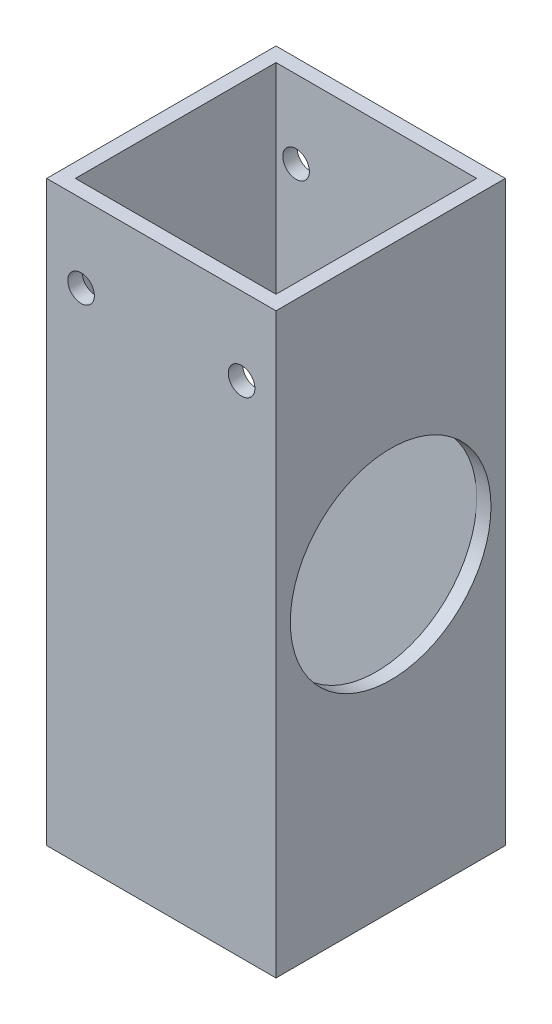
ISO-10303-21;
HEADER;
FILE_DESCRIPTION(('STEP AP214'),'2;1');
FILE_NAME('part.step','',(''),(''),'','','');
FILE_SCHEMA(('AUTOMOTIVE_DESIGN { 1 0 10303 214 1 1 1 1 }'));
ENDSEC;
DATA;
#1=APPLICATION_CONTEXT('core data for automotive mechanical design processes');
#2=APPLICATION_PROTOCOL_DEFINITION('international standard','automotive_design',2000,#1);
#3=PRODUCT_CONTEXT('',#1,'mechanical');
#4=PRODUCT('Part','Part','',(#3));
#5=PRODUCT_RELATED_PRODUCT_CATEGORY('part','',(#4));
#6=PRODUCT_DEFINITION_FORMATION('','',#4);
#7=PRODUCT_DEFINITION_CONTEXT('part definition',#1,'design');
#8=PRODUCT_DEFINITION('design','',#6,#7);
#9=PRODUCT_DEFINITION_SHAPE('','',#8);
#10=(LENGTH_UNIT() NAMED_UNIT(*) SI_UNIT(.MILLI.,.METRE.));
#11=(NAMED_UNIT(*) PLANE_ANGLE_UNIT() SI_UNIT($,.RADIAN.));
#12=(NAMED_UNIT(*) SI_UNIT($,.STERADIAN.) SOLID_ANGLE_UNIT());
#13=UNCERTAINTY_MEASURE_WITH_UNIT(LENGTH_MEASURE(1.E-05),#10,'distance_accuracy_value','');
#14=(GEOMETRIC_REPRESENTATION_CONTEXT(3) GLOBAL_UNCERTAINTY_ASSIGNED_CONTEXT((#13)) GLOBAL_UNIT_ASSIGNED_CONTEXT((#10,
#11,#12)) REPRESENTATION_CONTEXT('',''));
#15=CARTESIAN_POINT('',(0.,0.,0.));
#16=DIRECTION('',(0.,0.,1.));
#17=DIRECTION('',(1.,0.,0.));
#18=AXIS2_PLACEMENT_3D('',#15,#16,#17);
#19=CARTESIAN_POINT('',(11.1125,63.9989501845026,11.1125));
#20=DIRECTION('',(-1.,0.,0.));
#21=DIRECTION('',(0.,0.,1.));
#22=AXIS2_PLACEMENT_3D('',#19,#20,#21);
#23=PLANE('',#22);
#24=CARTESIAN_POINT('',(11.1125,33.3375,0.));
#25=DIRECTION('',(-1.,0.,0.));
#26=DIRECTION('',(0.,0.,1.));
#27=AXIS2_PLACEMENT_3D('',#24,#25,#26);
#28=CIRCLE('',#27,11.1125);
#29=CARTESIAN_POINT('',(11.1125,33.3375,11.1125));
#30=VERTEX_POINT('',#29);
#31=CARTESIAN_POINT('',(11.1125,33.3375,-11.1125));
#32=VERTEX_POINT('',#31);
#33=EDGE_CURVE('E59',#30,#32,#28,.T.);
#34=ORIENTED_EDGE('',*,*,#33,.F.);
#35=DIRECTION('',(0.,-1.,0.));
#36=VECTOR('',#35,1.);
#37=CARTESIAN_POINT('',(11.1125,63.9989501845026,11.1125));
#38=LINE('',#37,#36);
#39=CARTESIAN_POINT('',(11.1125,63.9989501845026,11.1125));
#40=VERTEX_POINT('',#39);
#41=EDGE_CURVE('E130',#40,#30,#38,.T.);
#42=ORIENTED_EDGE('',*,*,#41,.F.);
#43=DIRECTION('',(0.,0.,-1.));
#44=VECTOR('',#43,1.);
#45=CARTESIAN_POINT('',(11.1125,63.9989501845026,11.1125));
#46=LINE('',#45,#44);
#47=CARTESIAN_POINT('',(11.1125,63.9989501845026,-11.1125));
#48=VERTEX_POINT('',#47);
#49=EDGE_CURVE('E214',#40,#48,#46,.T.);
#50=ORIENTED_EDGE('',*,*,#49,.T.);
#51=DIRECTION('',(0.,-1.,0.));
#52=VECTOR('',#51,1.);
#53=CARTESIAN_POINT('',(11.1125,63.9989501845026,-11.1125));
#54=LINE('',#53,#52);
#55=EDGE_CURVE('E133',#48,#32,#54,.T.);
#56=ORIENTED_EDGE('',*,*,#55,.T.);
#57=EDGE_LOOP('',(#34,#42,#50,#56));
#58=FACE_BOUND('',#57,.T.);
#59=ADVANCED_FACE('F43',(#58),#23,.T.);
#60=CARTESIAN_POINT('',(-11.1125,63.9989501845026,-11.1125));
#61=DIRECTION('',(1.,0.,0.));
#62=DIRECTION('',(0.,0.,-1.));
#63=AXIS2_PLACEMENT_3D('',#60,#61,#62);
#64=PLANE('',#63);
#65=CARTESIAN_POINT('',(-11.1125,33.3375,0.));
#66=DIRECTION('',(1.,0.,0.));
#67=DIRECTION('',(0.,0.,-1.));
#68=AXIS2_PLACEMENT_3D('',#65,#66,#67);
#69=CIRCLE('',#68,11.1125);
#70=CARTESIAN_POINT('',(-11.1125,33.3375,-11.1125));
#71=VERTEX_POINT('',#70);
#72=CARTESIAN_POINT('',(-11.1125,33.3375,11.1125));
#73=VERTEX_POINT('',#72);
#74=EDGE_CURVE('E66',#71,#73,#69,.T.);
#75=ORIENTED_EDGE('',*,*,#74,.F.);
#76=DIRECTION('',(0.,-1.,0.));
#77=VECTOR('',#76,1.);
#78=CARTESIAN_POINT('',(-11.1125,63.9989501845026,-11.1125));
#79=LINE('',#78,#77);
#80=CARTESIAN_POINT('',(-11.1125,63.9989501845026,-11.1125));
#81=VERTEX_POINT('',#80);
#82=EDGE_CURVE('E155',#81,#71,#79,.T.);
#83=ORIENTED_EDGE('',*,*,#82,.F.);
#84=DIRECTION('',(0.,0.,1.));
#85=VECTOR('',#84,1.);
#86=CARTESIAN_POINT('',(-11.1125,63.9989501845026,-11.1125));
#87=LINE('',#86,#85);
#88=CARTESIAN_POINT('',(-11.1125,63.9989501845026,11.1125));
#89=VERTEX_POINT('',#88);
#90=EDGE_CURVE('E218',#81,#89,#87,.T.);
#91=ORIENTED_EDGE('',*,*,#90,.T.);
#92=DIRECTION('',(0.,-1.,0.));
#93=VECTOR('',#92,1.);
#94=CARTESIAN_POINT('',(-11.1125,63.9989501845026,11.1125));
#95=LINE('',#94,#93);
#96=EDGE_CURVE('E147',#89,#73,#95,.T.);
#97=ORIENTED_EDGE('',*,*,#96,.T.);
#98=EDGE_LOOP('',(#75,#83,#91,#97));
#99=FACE_BOUND('',#98,.T.);
#100=ADVANCED_FACE('F233',(#99),#64,.T.);
#101=CARTESIAN_POINT('',(0.,63.9989501845026,0.));
#102=DIRECTION('',(0.,1.,0.));
#103=DIRECTION('',(0.,0.,1.));
#104=AXIS2_PLACEMENT_3D('',#101,#102,#103);
#105=PLANE('',#104);
#106=DIRECTION('',(0.,0.,-1.));
#107=VECTOR('',#106,1.);
#108=CARTESIAN_POINT('',(12.7,63.9989501845026,12.7));
#109=LINE('',#108,#107);
#110=CARTESIAN_POINT('',(12.7,63.9989501845026,12.7));
#111=VERTEX_POINT('',#110);
#112=CARTESIAN_POINT('',(12.7,63.9989501845026,-12.7));
#113=VERTEX_POINT('',#112);
#114=EDGE_CURVE('E161',#111,#113,#109,.T.);
#115=ORIENTED_EDGE('',*,*,#114,.T.);
#116=DIRECTION('',(-1.,0.,0.));
#117=VECTOR('',#116,1.);
#118=CARTESIAN_POINT('',(12.7,63.9989501845026,-12.7));
#119=LINE('',#118,#117);
#120=CARTESIAN_POINT('',(-12.7,63.9989501845026,-12.7));
#121=VERTEX_POINT('',#120);
#122=EDGE_CURVE('E164',#113,#121,#119,.T.);
#123=ORIENTED_EDGE('',*,*,#122,.T.);
#124=DIRECTION('',(0.,0.,1.));
#125=VECTOR('',#124,1.);
#126=CARTESIAN_POINT('',(-12.7,63.9989501845026,-12.7));
#127=LINE('',#126,#125);
#128=CARTESIAN_POINT('',(-12.7,63.9989501845026,12.7));
#129=VERTEX_POINT('',#128);
#130=EDGE_CURVE('E167',#121,#129,#127,.T.);
#131=ORIENTED_EDGE('',*,*,#130,.T.);
#132=DIRECTION('',(1.,0.,0.));
#133=VECTOR('',#132,1.);
#134=CARTESIAN_POINT('',(-12.7,63.9989501845026,12.7));
#135=LINE('',#134,#133);
#136=EDGE_CURVE('E169',#129,#111,#135,.T.);
#137=ORIENTED_EDGE('',*,*,#136,.T.);
#138=EDGE_LOOP('',(#115,#123,#131,#137));
#139=FACE_BOUND('',#138,.T.);
#140=DIRECTION('',(-1.,0.,0.));
#141=VECTOR('',#140,1.);
#142=CARTESIAN_POINT('',(11.1125,63.9989501845026,-11.1125));
#143=LINE('',#142,#141);
#144=EDGE_CURVE('E216',#48,#81,#143,.T.);
#145=ORIENTED_EDGE('',*,*,#144,.F.);
#146=ORIENTED_EDGE('',*,*,#49,.F.);
#147=DIRECTION('',(1.,0.,0.));
#148=VECTOR('',#147,1.);
#149=CARTESIAN_POINT('',(-11.1125,63.9989501845026,11.1125));
#150=LINE('',#149,#148);
#151=EDGE_CURVE('E142',#89,#40,#150,.T.);
#152=ORIENTED_EDGE('',*,*,#151,.F.);
#153=ORIENTED_EDGE('',*,*,#90,.F.);
#154=EDGE_LOOP('',(#145,#146,#152,#153));
#155=FACE_BOUND('',#154,.T.);
#156=ADVANCED_FACE('F239',(#139,#155),#105,.T.);
#157=CARTESIAN_POINT('',(0.,0.,0.));
#158=DIRECTION('',(0.,1.,0.));
#159=DIRECTION('',(0.,0.,1.));
#160=AXIS2_PLACEMENT_3D('',#157,#158,#159);
#161=PLANE('',#160);
#162=DIRECTION('',(0.,0.,-1.));
#163=VECTOR('',#162,1.);
#164=CARTESIAN_POINT('',(12.7,0.,12.7));
#165=LINE('',#164,#163);
#166=CARTESIAN_POINT('',(12.7,0.,12.7));
#167=VERTEX_POINT('',#166);
#168=CARTESIAN_POINT('',(12.7,0.,-12.7));
#169=VERTEX_POINT('',#168);
#170=EDGE_CURVE('E160',#167,#169,#165,.T.);
#171=ORIENTED_EDGE('',*,*,#170,.F.);
#172=DIRECTION('',(1.,0.,0.));
#173=VECTOR('',#172,1.);
#174=CARTESIAN_POINT('',(-12.7,0.,12.7));
#175=LINE('',#174,#173);
#176=CARTESIAN_POINT('',(-12.7,0.,12.7));
#177=VERTEX_POINT('',#176);
#178=EDGE_CURVE('E165',#177,#167,#175,.T.);
#179=ORIENTED_EDGE('',*,*,#178,.F.);
#180=DIRECTION('',(0.,0.,1.));
#181=VECTOR('',#180,1.);
#182=CARTESIAN_POINT('',(-12.7,0.,-12.7));
#183=LINE('',#182,#181);
#184=CARTESIAN_POINT('',(-12.7,0.,-12.7));
#185=VERTEX_POINT('',#184);
#186=EDGE_CURVE('E176',#185,#177,#183,.T.);
#187=ORIENTED_EDGE('',*,*,#186,.F.);
#188=DIRECTION('',(-1.,0.,0.));
#189=VECTOR('',#188,1.);
#190=CARTESIAN_POINT('',(12.7,0.,-12.7));
#191=LINE('',#190,#189);
#192=EDGE_CURVE('E174',#169,#185,#191,.T.);
#193=ORIENTED_EDGE('',*,*,#192,.F.);
#194=EDGE_LOOP('',(#171,#179,#187,#193));
#195=FACE_BOUND('',#194,.T.);
#196=DIRECTION('',(0.,0.,-1.));
#197=VECTOR('',#196,1.);
#198=CARTESIAN_POINT('',(11.1125,0.,11.1125));
#199=LINE('',#198,#197);
#200=CARTESIAN_POINT('',(11.1125,0.,11.1125));
#201=VERTEX_POINT('',#200);
#202=CARTESIAN_POINT('',(11.1125,0.,-11.1125));
#203=VERTEX_POINT('',#202);
#204=EDGE_CURVE('E134',#201,#203,#199,.T.);
#205=ORIENTED_EDGE('',*,*,#204,.T.);
#206=DIRECTION('',(-1.,0.,0.));
#207=VECTOR('',#206,1.);
#208=CARTESIAN_POINT('',(11.1125,0.,-11.1125));
#209=LINE('',#208,#207);
#210=CARTESIAN_POINT('',(-11.1125,0.,-11.1125));
#211=VERTEX_POINT('',#210);
#212=EDGE_CURVE('E223',#203,#211,#209,.T.);
#213=ORIENTED_EDGE('',*,*,#212,.T.);
#214=DIRECTION('',(0.,0.,1.));
#215=VECTOR('',#214,1.);
#216=CARTESIAN_POINT('',(-11.1125,0.,-11.1125));
#217=LINE('',#216,#215);
#218=CARTESIAN_POINT('',(-11.1125,0.,11.1125));
#219=VERTEX_POINT('',#218);
#220=EDGE_CURVE('E225',#211,#219,#217,.T.);
#221=ORIENTED_EDGE('',*,*,#220,.T.);
#222=DIRECTION('',(1.,0.,0.));
#223=VECTOR('',#222,1.);
#224=CARTESIAN_POINT('',(-11.1125,0.,11.1125));
#225=LINE('',#224,#223);
#226=EDGE_CURVE('E150',#219,#201,#225,.T.);
#227=ORIENTED_EDGE('',*,*,#226,.T.);
#228=EDGE_LOOP('',(#205,#213,#221,#227));
#229=FACE_BOUND('',#228,.T.);
#230=ADVANCED_FACE('F229',(#195,#229),#161,.F.);
#231=CARTESIAN_POINT('',(12.7,63.9989501845026,12.7));
#232=DIRECTION('',(-1.,0.,0.));
#233=DIRECTION('',(0.,0.,1.));
#234=AXIS2_PLACEMENT_3D('',#231,#232,#233);
#235=PLANE('',#234);
#236=CARTESIAN_POINT('',(12.7,33.3375,0.));
#237=DIRECTION('',(1.,0.,0.));
#238=DIRECTION('',(0.,0.,-1.));
#239=AXIS2_PLACEMENT_3D('',#236,#237,#238);
#240=CIRCLE('',#239,11.1125);
#241=CARTESIAN_POINT('',(12.7,33.3375,-11.1125));
#242=VERTEX_POINT('',#241);
#243=EDGE_CURVE('E206',#242,#242,#240,.T.);
#244=ORIENTED_EDGE('',*,*,#243,.F.);
#245=EDGE_LOOP('',(#244));
#246=FACE_BOUND('',#245,.T.);
#247=ORIENTED_EDGE('',*,*,#170,.T.);
#248=DIRECTION('',(0.,-1.,0.));
#249=VECTOR('',#248,1.);
#250=CARTESIAN_POINT('',(12.7,63.9989501845026,-12.7));
#251=LINE('',#250,#249);
#252=EDGE_CURVE('E11',#113,#169,#251,.T.);
#253=ORIENTED_EDGE('',*,*,#252,.F.);
#254=ORIENTED_EDGE('',*,*,#114,.F.);
#255=DIRECTION('',(0.,-1.,0.));
#256=VECTOR('',#255,1.);
#257=CARTESIAN_POINT('',(12.7,63.9989501845026,12.7));
#258=LINE('',#257,#256);
#259=EDGE_CURVE('E171',#111,#167,#258,.T.);
#260=ORIENTED_EDGE('',*,*,#259,.T.);
#261=EDGE_LOOP('',(#247,#253,#254,#260));
#262=FACE_BOUND('',#261,.T.);
#263=ADVANCED_FACE('F45',(#246,#262),#235,.F.);
#264=CARTESIAN_POINT('',(12.7,63.9989501845026,-12.7));
#265=DIRECTION('',(0.,0.,1.));
#266=DIRECTION('',(1.,0.,0.));
#267=AXIS2_PLACEMENT_3D('',#264,#265,#266);
#268=PLANE('',#267);
#269=CARTESIAN_POINT('',(8.88994184736075,55.3810498155092,-12.7));
#270=DIRECTION('',(0.,0.,1.));
#271=DIRECTION('',(1.,0.,0.));
#272=AXIS2_PLACEMENT_3D('',#269,#270,#271);
#273=CIRCLE('',#272,1.47319999999558);
#274=CARTESIAN_POINT('',(10.3631418473563,55.3810498155092,-12.7));
#275=VERTEX_POINT('',#274);
#276=EDGE_CURVE('E195',#275,#275,#273,.T.);
#277=ORIENTED_EDGE('',*,*,#276,.T.);
#278=EDGE_LOOP('',(#277));
#279=FACE_BOUND('',#278,.T.);
#280=CARTESIAN_POINT('',(-8.88994184738029,55.3810498154906,-12.7));
#281=DIRECTION('',(0.,0.,1.));
#282=DIRECTION('',(1.,0.,0.));
#283=AXIS2_PLACEMENT_3D('',#280,#281,#282);
#284=CIRCLE('',#283,1.47320000001008);
#285=CARTESIAN_POINT('',(-7.4167418473702,55.3810498154906,-12.7));
#286=VERTEX_POINT('',#285);
#287=EDGE_CURVE('E192',#286,#286,#284,.T.);
#288=ORIENTED_EDGE('',*,*,#287,.T.);
#289=EDGE_LOOP('',(#288));
#290=FACE_BOUND('',#289,.T.);
#291=ORIENTED_EDGE('',*,*,#192,.T.);
#292=DIRECTION('',(0.,-1.,0.));
#293=VECTOR('',#292,1.);
#294=CARTESIAN_POINT('',(-12.7,63.9989501845026,-12.7));
#295=LINE('',#294,#293);
#296=EDGE_CURVE('E52',#121,#185,#295,.T.);
#297=ORIENTED_EDGE('',*,*,#296,.F.);
#298=ORIENTED_EDGE('',*,*,#122,.F.);
#299=ORIENTED_EDGE('',*,*,#252,.T.);
#300=EDGE_LOOP('',(#291,#297,#298,#299));
#301=FACE_BOUND('',#300,.T.);
#302=ADVANCED_FACE('F275',(#279,#290,#301),#268,.F.);
#303=CARTESIAN_POINT('',(-12.7,63.9989501845026,-12.7));
#304=DIRECTION('',(1.,0.,0.));
#305=DIRECTION('',(0.,0.,-1.));
#306=AXIS2_PLACEMENT_3D('',#303,#304,#305);
#307=PLANE('',#306);
#308=CARTESIAN_POINT('',(-12.7,33.3375,0.));
#309=DIRECTION('',(1.,0.,0.));
#310=DIRECTION('',(0.,0.,-1.));
#311=AXIS2_PLACEMENT_3D('',#308,#309,#310);
#312=CIRCLE('',#311,11.1125);
#313=CARTESIAN_POINT('',(-12.7,33.3375,-11.1125));
#314=VERTEX_POINT('',#313);
#315=EDGE_CURVE('E207',#314,#314,#312,.T.);
#316=ORIENTED_EDGE('',*,*,#315,.T.);
#317=EDGE_LOOP('',(#316));
#318=FACE_BOUND('',#317,.T.);
#319=ORIENTED_EDGE('',*,*,#186,.T.);
#320=DIRECTION('',(0.,-1.,0.));
#321=VECTOR('',#320,1.);
#322=CARTESIAN_POINT('',(-12.7,63.9989501845026,12.7));
#323=LINE('',#322,#321);
#324=EDGE_CURVE('E181',#129,#177,#323,.T.);
#325=ORIENTED_EDGE('',*,*,#324,.F.);
#326=ORIENTED_EDGE('',*,*,#130,.F.);
#327=ORIENTED_EDGE('',*,*,#296,.T.);
#328=EDGE_LOOP('',(#319,#325,#326,#327));
#329=FACE_BOUND('',#328,.T.);
#330=ADVANCED_FACE('F269',(#318,#329),#307,.F.);
#331=CARTESIAN_POINT('',(-12.7,63.9989501845026,12.7));
#332=DIRECTION('',(0.,0.,-1.));
#333=DIRECTION('',(-1.,0.,0.));
#334=AXIS2_PLACEMENT_3D('',#331,#332,#333);
#335=PLANE('',#334);
#336=CARTESIAN_POINT('',(8.88994184736075,55.3810498155092,12.7));
#337=DIRECTION('',(0.,0.,-1.));
#338=DIRECTION('',(-1.,0.,0.));
#339=AXIS2_PLACEMENT_3D('',#336,#337,#338);
#340=CIRCLE('',#339,1.47319999999558);
#341=CARTESIAN_POINT('',(7.41674184736516,55.3810498155092,12.7));
#342=VERTEX_POINT('',#341);
#343=EDGE_CURVE('E420',#342,#342,#340,.T.);
#344=ORIENTED_EDGE('',*,*,#343,.T.);
#345=EDGE_LOOP('',(#344));
#346=FACE_BOUND('',#345,.T.);
#347=CARTESIAN_POINT('',(-8.88994184738029,55.3810498154906,12.7));
#348=DIRECTION('',(0.,0.,-1.));
#349=DIRECTION('',(-1.,0.,0.));
#350=AXIS2_PLACEMENT_3D('',#347,#348,#349);
#351=CIRCLE('',#350,1.47320000001008);
#352=CARTESIAN_POINT('',(-10.3631418473904,55.3810498154906,12.7));
#353=VERTEX_POINT('',#352);
#354=EDGE_CURVE('E188',#353,#353,#351,.T.);
#355=ORIENTED_EDGE('',*,*,#354,.T.);
#356=EDGE_LOOP('',(#355));
#357=FACE_BOUND('',#356,.T.);
#358=ORIENTED_EDGE('',*,*,#178,.T.);
#359=ORIENTED_EDGE('',*,*,#259,.F.);
#360=ORIENTED_EDGE('',*,*,#136,.F.);
#361=ORIENTED_EDGE('',*,*,#324,.T.);
#362=EDGE_LOOP('',(#358,#359,#360,#361));
#363=FACE_BOUND('',#362,.T.);
#364=ADVANCED_FACE('F264',(#346,#357,#363),#335,.F.);
#365=EDGE_CURVE('E119',#32,#30,#28,.T.);
#366=ORIENTED_EDGE('',*,*,#365,.F.);
#367=EDGE_CURVE('E158',#32,#203,#54,.T.);
#368=ORIENTED_EDGE('',*,*,#367,.T.);
#369=ORIENTED_EDGE('',*,*,#204,.F.);
#370=EDGE_CURVE('E136',#30,#201,#38,.T.);
#371=ORIENTED_EDGE('',*,*,#370,.F.);
#372=EDGE_LOOP('',(#366,#368,#369,#371));
#373=FACE_BOUND('',#372,.T.);
#374=ADVANCED_FACE('F137',(#373),#23,.T.);
#375=CARTESIAN_POINT('',(11.1125,63.9989501845026,-11.1125));
#376=DIRECTION('',(0.,0.,1.));
#377=DIRECTION('',(1.,0.,0.));
#378=AXIS2_PLACEMENT_3D('',#375,#376,#377);
#379=PLANE('',#378);
#380=CARTESIAN_POINT('',(8.88994184736075,55.3810498155092,-11.1125));
#381=DIRECTION('',(0.,0.,1.));
#382=DIRECTION('',(1.,0.,0.));
#383=AXIS2_PLACEMENT_3D('',#380,#381,#382);
#384=CIRCLE('',#383,1.47319999999558);
#385=CARTESIAN_POINT('',(10.3631418473563,55.3810498155092,-11.1125));
#386=VERTEX_POINT('',#385);
#387=EDGE_CURVE('E200',#386,#386,#384,.T.);
#388=ORIENTED_EDGE('',*,*,#387,.F.);
#389=EDGE_LOOP('',(#388));
#390=FACE_BOUND('',#389,.T.);
#391=CARTESIAN_POINT('',(-8.88994184738029,55.3810498154906,-11.1125));
#392=DIRECTION('',(0.,0.,1.));
#393=DIRECTION('',(1.,0.,0.));
#394=AXIS2_PLACEMENT_3D('',#391,#392,#393);
#395=CIRCLE('',#394,1.47320000001008);
#396=CARTESIAN_POINT('',(-7.4167418473702,55.3810498154906,-11.1125));
#397=VERTEX_POINT('',#396);
#398=EDGE_CURVE('E187',#397,#397,#395,.T.);
#399=ORIENTED_EDGE('',*,*,#398,.F.);
#400=EDGE_LOOP('',(#399));
#401=FACE_BOUND('',#400,.T.);
#402=ORIENTED_EDGE('',*,*,#367,.F.);
#403=ORIENTED_EDGE('',*,*,#55,.F.);
#404=ORIENTED_EDGE('',*,*,#144,.T.);
#405=ORIENTED_EDGE('',*,*,#82,.T.);
#406=EDGE_CURVE('E154',#71,#211,#79,.T.);
#407=ORIENTED_EDGE('',*,*,#406,.T.);
#408=ORIENTED_EDGE('',*,*,#212,.F.);
#409=EDGE_LOOP('',(#402,#403,#404,#405,#407,#408));
#410=FACE_BOUND('',#409,.T.);
#411=ADVANCED_FACE('F241',(#390,#401,#410),#379,.T.);
#412=EDGE_CURVE('E210',#73,#71,#69,.T.);
#413=ORIENTED_EDGE('',*,*,#412,.F.);
#414=EDGE_CURVE('E146',#73,#219,#95,.T.);
#415=ORIENTED_EDGE('',*,*,#414,.T.);
#416=ORIENTED_EDGE('',*,*,#220,.F.);
#417=ORIENTED_EDGE('',*,*,#406,.F.);
#418=EDGE_LOOP('',(#413,#415,#416,#417));
#419=FACE_BOUND('',#418,.T.);
#420=ADVANCED_FACE('F243',(#419),#64,.T.);
#421=CARTESIAN_POINT('',(-11.1125,63.9989501845026,11.1125));
#422=DIRECTION('',(0.,0.,-1.));
#423=DIRECTION('',(-1.,0.,0.));
#424=AXIS2_PLACEMENT_3D('',#421,#422,#423);
#425=PLANE('',#424);
#426=CARTESIAN_POINT('',(8.88994184736075,55.3810498155092,11.1125));
#427=DIRECTION('',(0.,0.,-1.));
#428=DIRECTION('',(-1.,0.,0.));
#429=AXIS2_PLACEMENT_3D('',#426,#427,#428);
#430=CIRCLE('',#429,1.47319999999558);
#431=CARTESIAN_POINT('',(7.41674184736516,55.3810498155092,11.1125));
#432=VERTEX_POINT('',#431);
#433=EDGE_CURVE('E47',#432,#432,#430,.T.);
#434=ORIENTED_EDGE('',*,*,#433,.F.);
#435=EDGE_LOOP('',(#434));
#436=FACE_BOUND('',#435,.T.);
#437=CARTESIAN_POINT('',(-8.88994184738029,55.3810498154906,11.1125));
#438=DIRECTION('',(0.,0.,-1.));
#439=DIRECTION('',(-1.,0.,0.));
#440=AXIS2_PLACEMENT_3D('',#437,#438,#439);
#441=CIRCLE('',#440,1.47320000001008);
#442=CARTESIAN_POINT('',(-10.3631418473904,55.3810498154906,11.1125));
#443=VERTEX_POINT('',#442);
#444=EDGE_CURVE('E185',#443,#443,#441,.T.);
#445=ORIENTED_EDGE('',*,*,#444,.F.);
#446=EDGE_LOOP('',(#445));
#447=FACE_BOUND('',#446,.T.);
#448=ORIENTED_EDGE('',*,*,#41,.T.);
#449=ORIENTED_EDGE('',*,*,#370,.T.);
#450=ORIENTED_EDGE('',*,*,#226,.F.);
#451=ORIENTED_EDGE('',*,*,#414,.F.);
#452=ORIENTED_EDGE('',*,*,#96,.F.);
#453=ORIENTED_EDGE('',*,*,#151,.T.);
#454=EDGE_LOOP('',(#448,#449,#450,#451,#452,#453));
#455=FACE_BOUND('',#454,.T.);
#456=ADVANCED_FACE('F144',(#436,#447,#455),#425,.T.);
#457=CARTESIAN_POINT('',(-12.7,33.3375,0.));
#458=DIRECTION('',(1.,0.,0.));
#459=DIRECTION('',(0.,0.,-1.));
#460=AXIS2_PLACEMENT_3D('',#457,#458,#459);
#461=CYLINDRICAL_SURFACE('',#460,11.1125);
#462=ORIENTED_EDGE('',*,*,#74,.T.);
#463=ORIENTED_EDGE('',*,*,#412,.T.);
#464=EDGE_LOOP('',(#462,#463));
#465=FACE_BOUND('',#464,.T.);
#466=ORIENTED_EDGE('',*,*,#315,.F.);
#467=EDGE_LOOP('',(#466));
#468=FACE_BOUND('',#467,.T.);
#469=ADVANCED_FACE('F251',(#465,#468),#461,.F.);
#470=ORIENTED_EDGE('',*,*,#33,.T.);
#471=ORIENTED_EDGE('',*,*,#365,.T.);
#472=EDGE_LOOP('',(#470,#471));
#473=FACE_BOUND('',#472,.T.);
#474=ORIENTED_EDGE('',*,*,#243,.T.);
#475=EDGE_LOOP('',(#474));
#476=FACE_BOUND('',#475,.T.);
#477=ADVANCED_FACE('F120',(#473,#476),#461,.F.);
#478=CARTESIAN_POINT('',(-8.88994184738029,55.3810498154906,12.7));
#479=DIRECTION('',(0.,0.,-1.));
#480=DIRECTION('',(-1.,0.,0.));
#481=AXIS2_PLACEMENT_3D('',#478,#479,#480);
#482=CYLINDRICAL_SURFACE('',#481,1.47320000001008);
#483=ORIENTED_EDGE('',*,*,#444,.T.);
#484=EDGE_LOOP('',(#483));
#485=FACE_BOUND('',#484,.T.);
#486=ORIENTED_EDGE('',*,*,#354,.F.);
#487=EDGE_LOOP('',(#486));
#488=FACE_BOUND('',#487,.T.);
#489=ADVANCED_FACE('F380',(#485,#488),#482,.F.);
#490=ORIENTED_EDGE('',*,*,#398,.T.);
#491=EDGE_LOOP('',(#490));
#492=FACE_BOUND('',#491,.T.);
#493=ORIENTED_EDGE('',*,*,#287,.F.);
#494=EDGE_LOOP('',(#493));
#495=FACE_BOUND('',#494,.T.);
#496=ADVANCED_FACE('F388',(#492,#495),#482,.F.);
#497=CARTESIAN_POINT('',(8.88994184736075,55.3810498155092,12.7));
#498=DIRECTION('',(0.,0.,-1.));
#499=DIRECTION('',(-1.,0.,0.));
#500=AXIS2_PLACEMENT_3D('',#497,#498,#499);
#501=CYLINDRICAL_SURFACE('',#500,1.47319999999558);
#502=ORIENTED_EDGE('',*,*,#433,.T.);
#503=EDGE_LOOP('',(#502));
#504=FACE_BOUND('',#503,.T.);
#505=ORIENTED_EDGE('',*,*,#343,.F.);
#506=EDGE_LOOP('',(#505));
#507=FACE_BOUND('',#506,.T.);
#508=ADVANCED_FACE('F396',(#504,#507),#501,.F.);
#509=ORIENTED_EDGE('',*,*,#387,.T.);
#510=EDGE_LOOP('',(#509));
#511=FACE_BOUND('',#510,.T.);
#512=ORIENTED_EDGE('',*,*,#276,.F.);
#513=EDGE_LOOP('',(#512));
#514=FACE_BOUND('',#513,.T.);
#515=ADVANCED_FACE('F404',(#511,#514),#501,.F.);
#516=CLOSED_SHELL('',(#59,#100,#156,#230,#263,#302,#330,#364,#374,#411,#420,#456,#469,#477,#489,
#496,#508,#515));
#517=MANIFOLD_SOLID_BREP('B2',#516);
#518=ADVANCED_BREP_SHAPE_REPRESENTATION('',(#18,#517),#14);
#519=SHAPE_DEFINITION_REPRESENTATION(#9,#518);
ENDSEC;
END-ISO-10303-21;
